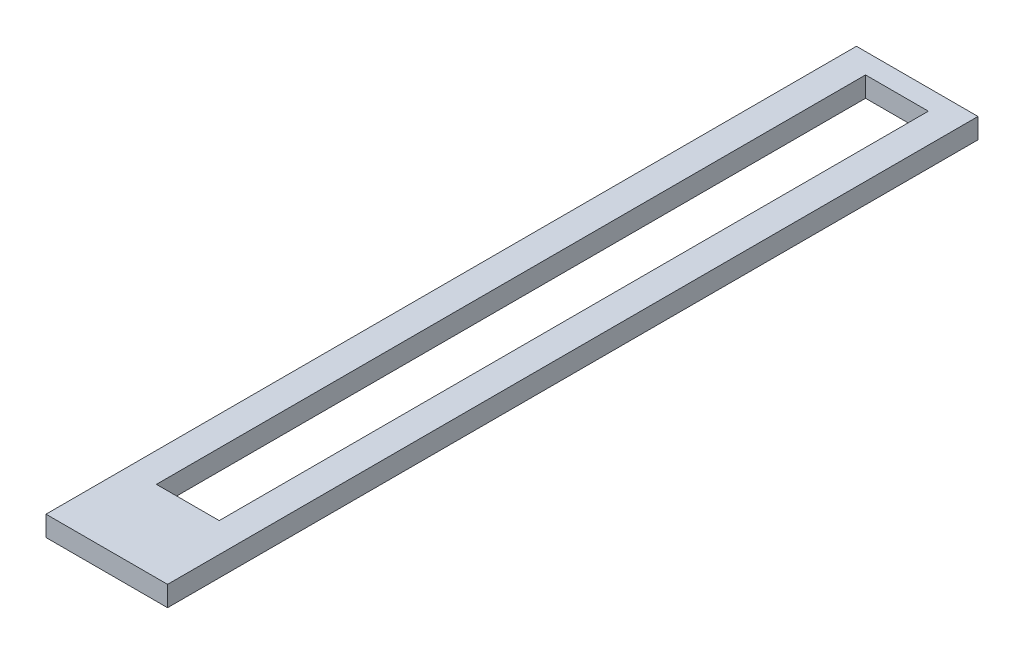
ISO-10303-21;
HEADER;
FILE_DESCRIPTION(('STEP AP214'),'2;1');
FILE_NAME('part.step','',(''),(''),'','','');
FILE_SCHEMA(('AUTOMOTIVE_DESIGN { 1 0 10303 214 1 1 1 1 }'));
ENDSEC;
DATA;
#1=APPLICATION_CONTEXT('core data for automotive mechanical design processes');
#2=APPLICATION_PROTOCOL_DEFINITION('international standard','automotive_design',2000,#1);
#3=PRODUCT_CONTEXT('',#1,'mechanical');
#4=PRODUCT('Part','Part','',(#3));
#5=PRODUCT_RELATED_PRODUCT_CATEGORY('part','',(#4));
#6=PRODUCT_DEFINITION_FORMATION('','',#4);
#7=PRODUCT_DEFINITION_CONTEXT('part definition',#1,'design');
#8=PRODUCT_DEFINITION('design','',#6,#7);
#9=PRODUCT_DEFINITION_SHAPE('','',#8);
#10=(LENGTH_UNIT() NAMED_UNIT(*) SI_UNIT(.MILLI.,.METRE.));
#11=(NAMED_UNIT(*) PLANE_ANGLE_UNIT() SI_UNIT($,.RADIAN.));
#12=(NAMED_UNIT(*) SI_UNIT($,.STERADIAN.) SOLID_ANGLE_UNIT());
#13=UNCERTAINTY_MEASURE_WITH_UNIT(LENGTH_MEASURE(1.E-05),#10,'distance_accuracy_value','');
#14=(GEOMETRIC_REPRESENTATION_CONTEXT(3) GLOBAL_UNCERTAINTY_ASSIGNED_CONTEXT((#13)) GLOBAL_UNIT_ASSIGNED_CONTEXT((#10,
#11,#12)) REPRESENTATION_CONTEXT('',''));
#15=CARTESIAN_POINT('',(0.,0.,0.));
#16=DIRECTION('',(0.,0.,1.));
#17=DIRECTION('',(1.,0.,0.));
#18=AXIS2_PLACEMENT_3D('',#15,#16,#17);
#19=CARTESIAN_POINT('',(15.,5.,100.));
#20=DIRECTION('',(-1.,0.,0.));
#21=DIRECTION('',(0.,0.,1.));
#22=AXIS2_PLACEMENT_3D('',#19,#20,#21);
#23=PLANE('',#22);
#24=DIRECTION('',(0.,0.,-1.));
#25=VECTOR('',#24,1.);
#26=CARTESIAN_POINT('',(15.,0.,100.));
#27=LINE('',#26,#25);
#28=CARTESIAN_POINT('',(15.,0.,100.));
#29=VERTEX_POINT('',#28);
#30=CARTESIAN_POINT('',(15.,0.,-99.9999999999999));
#31=VERTEX_POINT('',#30);
#32=EDGE_CURVE('E153',#29,#31,#27,.T.);
#33=ORIENTED_EDGE('',*,*,#32,.T.);
#34=DIRECTION('',(0.,-1.,0.));
#35=VECTOR('',#34,1.);
#36=CARTESIAN_POINT('',(15.,5.,-99.9999999999999));
#37=LINE('',#36,#35);
#38=CARTESIAN_POINT('',(15.,5.,-99.9999999999999));
#39=VERTEX_POINT('',#38);
#40=EDGE_CURVE('E11',#39,#31,#37,.T.);
#41=ORIENTED_EDGE('',*,*,#40,.F.);
#42=DIRECTION('',(0.,0.,-1.));
#43=VECTOR('',#42,1.);
#44=CARTESIAN_POINT('',(15.,5.,100.));
#45=LINE('',#44,#43);
#46=CARTESIAN_POINT('',(15.,5.,100.));
#47=VERTEX_POINT('',#46);
#48=EDGE_CURVE('E159',#47,#39,#45,.T.);
#49=ORIENTED_EDGE('',*,*,#48,.F.);
#50=DIRECTION('',(0.,-1.,0.));
#51=VECTOR('',#50,1.);
#52=CARTESIAN_POINT('',(15.,5.,100.));
#53=LINE('',#52,#51);
#54=EDGE_CURVE('E173',#47,#29,#53,.T.);
#55=ORIENTED_EDGE('',*,*,#54,.T.);
#56=EDGE_LOOP('',(#33,#41,#49,#55));
#57=FACE_BOUND('',#56,.T.);
#58=ADVANCED_FACE('F45',(#57),#23,.F.);
#59=CARTESIAN_POINT('',(-15.,5.,-99.9999999999999));
#60=DIRECTION('',(0.,0.,1.));
#61=DIRECTION('',(1.,0.,0.));
#62=AXIS2_PLACEMENT_3D('',#59,#60,#61);
#63=PLANE('',#62);
#64=DIRECTION('',(-1.,0.,0.));
#65=VECTOR('',#64,1.);
#66=CARTESIAN_POINT('',(-15.,0.,-99.9999999999999));
#67=LINE('',#66,#65);
#68=CARTESIAN_POINT('',(-15.,0.,-99.9999999999999));
#69=VERTEX_POINT('',#68);
#70=EDGE_CURVE('E177',#31,#69,#67,.T.);
#71=ORIENTED_EDGE('',*,*,#70,.T.);
#72=DIRECTION('',(0.,-1.,0.));
#73=VECTOR('',#72,1.);
#74=CARTESIAN_POINT('',(-15.,5.,-99.9999999999999));
#75=LINE('',#74,#73);
#76=CARTESIAN_POINT('',(-15.,5.,-99.9999999999999));
#77=VERTEX_POINT('',#76);
#78=EDGE_CURVE('E53',#77,#69,#75,.T.);
#79=ORIENTED_EDGE('',*,*,#78,.F.);
#80=DIRECTION('',(-1.,0.,0.));
#81=VECTOR('',#80,1.);
#82=CARTESIAN_POINT('',(-15.,5.,-99.9999999999999));
#83=LINE('',#82,#81);
#84=EDGE_CURVE('E163',#39,#77,#83,.T.);
#85=ORIENTED_EDGE('',*,*,#84,.F.);
#86=ORIENTED_EDGE('',*,*,#40,.T.);
#87=EDGE_LOOP('',(#71,#79,#85,#86));
#88=FACE_BOUND('',#87,.T.);
#89=ADVANCED_FACE('F211',(#88),#63,.F.);
#90=CARTESIAN_POINT('',(-15.,5.,100.));
#91=DIRECTION('',(1.,0.,0.));
#92=DIRECTION('',(0.,0.,-1.));
#93=AXIS2_PLACEMENT_3D('',#90,#91,#92);
#94=PLANE('',#93);
#95=DIRECTION('',(0.,0.,1.));
#96=VECTOR('',#95,1.);
#97=CARTESIAN_POINT('',(-15.,0.,100.));
#98=LINE('',#97,#96);
#99=CARTESIAN_POINT('',(-15.,0.,100.));
#100=VERTEX_POINT('',#99);
#101=EDGE_CURVE('E180',#69,#100,#98,.T.);
#102=ORIENTED_EDGE('',*,*,#101,.T.);
#103=DIRECTION('',(0.,-1.,0.));
#104=VECTOR('',#103,1.);
#105=CARTESIAN_POINT('',(-15.,5.,100.));
#106=LINE('',#105,#104);
#107=CARTESIAN_POINT('',(-15.,5.,100.));
#108=VERTEX_POINT('',#107);
#109=EDGE_CURVE('E188',#108,#100,#106,.T.);
#110=ORIENTED_EDGE('',*,*,#109,.F.);
#111=DIRECTION('',(0.,0.,1.));
#112=VECTOR('',#111,1.);
#113=CARTESIAN_POINT('',(-15.,5.,100.));
#114=LINE('',#113,#112);
#115=EDGE_CURVE('E167',#77,#108,#114,.T.);
#116=ORIENTED_EDGE('',*,*,#115,.F.);
#117=ORIENTED_EDGE('',*,*,#78,.T.);
#118=EDGE_LOOP('',(#102,#110,#116,#117));
#119=FACE_BOUND('',#118,.T.);
#120=ADVANCED_FACE('F197',(#119),#94,.F.);
#121=CARTESIAN_POINT('',(-15.,5.,100.));
#122=DIRECTION('',(0.,0.,-1.));
#123=DIRECTION('',(-1.,0.,0.));
#124=AXIS2_PLACEMENT_3D('',#121,#122,#123);
#125=PLANE('',#124);
#126=DIRECTION('',(1.,0.,0.));
#127=VECTOR('',#126,1.);
#128=CARTESIAN_POINT('',(-15.,0.,100.));
#129=LINE('',#128,#127);
#130=EDGE_CURVE('E164',#100,#29,#129,.T.);
#131=ORIENTED_EDGE('',*,*,#130,.T.);
#132=ORIENTED_EDGE('',*,*,#54,.F.);
#133=DIRECTION('',(1.,0.,0.));
#134=VECTOR('',#133,1.);
#135=CARTESIAN_POINT('',(-15.,5.,100.));
#136=LINE('',#135,#134);
#137=EDGE_CURVE('E170',#108,#47,#136,.T.);
#138=ORIENTED_EDGE('',*,*,#137,.F.);
#139=ORIENTED_EDGE('',*,*,#109,.T.);
#140=EDGE_LOOP('',(#131,#132,#138,#139));
#141=FACE_BOUND('',#140,.T.);
#142=ADVANCED_FACE('F204',(#141),#125,.F.);
#143=CARTESIAN_POINT('',(0.,5.,0.));
#144=DIRECTION('',(0.,-1.,0.));
#145=DIRECTION('',(0.,0.,-1.));
#146=AXIS2_PLACEMENT_3D('',#143,#144,#145);
#147=PLANE('',#146);
#148=DIRECTION('',(1.,0.,0.));
#149=VECTOR('',#148,1.);
#150=CARTESIAN_POINT('',(-7.74999999999998,5.,80.0000000000001));
#151=LINE('',#150,#149);
#152=CARTESIAN_POINT('',(-7.74999999999998,5.,80.0000000000001));
#153=VERTEX_POINT('',#152);
#154=CARTESIAN_POINT('',(7.75000000000002,5.,80.0000000000001));
#155=VERTEX_POINT('',#154);
#156=EDGE_CURVE('E144',#153,#155,#151,.T.);
#157=ORIENTED_EDGE('',*,*,#156,.F.);
#158=DIRECTION('',(0.,0.,1.));
#159=VECTOR('',#158,1.);
#160=CARTESIAN_POINT('',(-7.75,5.,-94.9999999999999));
#161=LINE('',#160,#159);
#162=CARTESIAN_POINT('',(-7.75,5.,-94.9999999999999));
#163=VERTEX_POINT('',#162);
#164=EDGE_CURVE('E60',#163,#153,#161,.T.);
#165=ORIENTED_EDGE('',*,*,#164,.F.);
#166=DIRECTION('',(-1.,0.,0.));
#167=VECTOR('',#166,1.);
#168=CARTESIAN_POINT('',(-7.75,5.,-94.9999999999999));
#169=LINE('',#168,#167);
#170=CARTESIAN_POINT('',(7.75,5.,-94.9999999999999));
#171=VERTEX_POINT('',#170);
#172=EDGE_CURVE('E131',#171,#163,#169,.T.);
#173=ORIENTED_EDGE('',*,*,#172,.F.);
#174=DIRECTION('',(0.,0.,-1.));
#175=VECTOR('',#174,1.);
#176=CARTESIAN_POINT('',(7.75,5.,-94.9999999999999));
#177=LINE('',#176,#175);
#178=EDGE_CURVE('E135',#155,#171,#177,.T.);
#179=ORIENTED_EDGE('',*,*,#178,.F.);
#180=EDGE_LOOP('',(#157,#165,#173,#179));
#181=FACE_BOUND('',#180,.T.);
#182=ORIENTED_EDGE('',*,*,#48,.T.);
#183=ORIENTED_EDGE('',*,*,#84,.T.);
#184=ORIENTED_EDGE('',*,*,#115,.T.);
#185=ORIENTED_EDGE('',*,*,#137,.T.);
#186=EDGE_LOOP('',(#182,#183,#184,#185));
#187=FACE_BOUND('',#186,.T.);
#188=ADVANCED_FACE('F210',(#181,#187),#147,.F.);
#189=CARTESIAN_POINT('',(0.,0.,0.));
#190=DIRECTION('',(0.,-1.,0.));
#191=DIRECTION('',(0.,0.,-1.));
#192=AXIS2_PLACEMENT_3D('',#189,#190,#191);
#193=PLANE('',#192);
#194=DIRECTION('',(0.,0.,1.));
#195=VECTOR('',#194,1.);
#196=CARTESIAN_POINT('',(-7.75,0.,-94.9999999999999));
#197=LINE('',#196,#195);
#198=CARTESIAN_POINT('',(-7.75,0.,-94.9999999999999));
#199=VERTEX_POINT('',#198);
#200=CARTESIAN_POINT('',(-7.74999999999998,0.,80.0000000000001));
#201=VERTEX_POINT('',#200);
#202=EDGE_CURVE('E112',#199,#201,#197,.T.);
#203=ORIENTED_EDGE('',*,*,#202,.T.);
#204=DIRECTION('',(1.,0.,0.));
#205=VECTOR('',#204,1.);
#206=CARTESIAN_POINT('',(-7.74999999999998,0.,80.0000000000001));
#207=LINE('',#206,#205);
#208=CARTESIAN_POINT('',(7.75000000000002,0.,80.0000000000001));
#209=VERTEX_POINT('',#208);
#210=EDGE_CURVE('E122',#201,#209,#207,.T.);
#211=ORIENTED_EDGE('',*,*,#210,.T.);
#212=DIRECTION('',(0.,0.,-1.));
#213=VECTOR('',#212,1.);
#214=CARTESIAN_POINT('',(7.75,0.,-94.9999999999999));
#215=LINE('',#214,#213);
#216=CARTESIAN_POINT('',(7.75,0.,-94.9999999999999));
#217=VERTEX_POINT('',#216);
#218=EDGE_CURVE('E68',#209,#217,#215,.T.);
#219=ORIENTED_EDGE('',*,*,#218,.T.);
#220=DIRECTION('',(-1.,0.,0.));
#221=VECTOR('',#220,1.);
#222=CARTESIAN_POINT('',(-7.75,0.,-94.9999999999999));
#223=LINE('',#222,#221);
#224=EDGE_CURVE('E119',#217,#199,#223,.T.);
#225=ORIENTED_EDGE('',*,*,#224,.T.);
#226=EDGE_LOOP('',(#203,#211,#219,#225));
#227=FACE_BOUND('',#226,.T.);
#228=ORIENTED_EDGE('',*,*,#32,.F.);
#229=ORIENTED_EDGE('',*,*,#130,.F.);
#230=ORIENTED_EDGE('',*,*,#101,.F.);
#231=ORIENTED_EDGE('',*,*,#70,.F.);
#232=EDGE_LOOP('',(#228,#229,#230,#231));
#233=FACE_BOUND('',#232,.T.);
#234=ADVANCED_FACE('F127',(#227,#233),#193,.T.);
#235=CARTESIAN_POINT('',(-7.75,0.,-94.9999999999999));
#236=DIRECTION('',(-1.,0.,0.));
#237=DIRECTION('',(0.,0.,1.));
#238=AXIS2_PLACEMENT_3D('',#235,#236,#237);
#239=PLANE('',#238);
#240=ORIENTED_EDGE('',*,*,#164,.T.);
#241=DIRECTION('',(0.,1.,0.));
#242=VECTOR('',#241,1.);
#243=CARTESIAN_POINT('',(-7.74999999999998,0.,80.0000000000001));
#244=LINE('',#243,#242);
#245=EDGE_CURVE('E108',#201,#153,#244,.T.);
#246=ORIENTED_EDGE('',*,*,#245,.F.);
#247=ORIENTED_EDGE('',*,*,#202,.F.);
#248=DIRECTION('',(0.,1.,0.));
#249=VECTOR('',#248,1.);
#250=CARTESIAN_POINT('',(-7.75,0.,-94.9999999999999));
#251=LINE('',#250,#249);
#252=EDGE_CURVE('E150',#199,#163,#251,.T.);
#253=ORIENTED_EDGE('',*,*,#252,.T.);
#254=EDGE_LOOP('',(#240,#246,#247,#253));
#255=FACE_BOUND('',#254,.T.);
#256=ADVANCED_FACE('F110',(#255),#239,.F.);
#257=CARTESIAN_POINT('',(-7.75,0.,-94.9999999999999));
#258=DIRECTION('',(0.,0.,-1.));
#259=DIRECTION('',(-1.,0.,0.));
#260=AXIS2_PLACEMENT_3D('',#257,#258,#259);
#261=PLANE('',#260);
#262=ORIENTED_EDGE('',*,*,#172,.T.);
#263=ORIENTED_EDGE('',*,*,#252,.F.);
#264=ORIENTED_EDGE('',*,*,#224,.F.);
#265=DIRECTION('',(0.,1.,0.));
#266=VECTOR('',#265,1.);
#267=CARTESIAN_POINT('',(7.75,0.,-94.9999999999999));
#268=LINE('',#267,#266);
#269=EDGE_CURVE('E154',#217,#171,#268,.T.);
#270=ORIENTED_EDGE('',*,*,#269,.T.);
#271=EDGE_LOOP('',(#262,#263,#264,#270));
#272=FACE_BOUND('',#271,.T.);
#273=ADVANCED_FACE('F228',(#272),#261,.F.);
#274=CARTESIAN_POINT('',(7.75,0.,-94.9999999999999));
#275=DIRECTION('',(1.,0.,0.));
#276=DIRECTION('',(0.,0.,-1.));
#277=AXIS2_PLACEMENT_3D('',#274,#275,#276);
#278=PLANE('',#277);
#279=ORIENTED_EDGE('',*,*,#178,.T.);
#280=ORIENTED_EDGE('',*,*,#269,.F.);
#281=ORIENTED_EDGE('',*,*,#218,.F.);
#282=DIRECTION('',(0.,1.,0.));
#283=VECTOR('',#282,1.);
#284=CARTESIAN_POINT('',(7.75000000000002,0.,80.0000000000001));
#285=LINE('',#284,#283);
#286=EDGE_CURVE('E118',#209,#155,#285,.T.);
#287=ORIENTED_EDGE('',*,*,#286,.T.);
#288=EDGE_LOOP('',(#279,#280,#281,#287));
#289=FACE_BOUND('',#288,.T.);
#290=ADVANCED_FACE('F231',(#289),#278,.F.);
#291=CARTESIAN_POINT('',(-7.74999999999998,0.,80.0000000000001));
#292=DIRECTION('',(0.,0.,1.));
#293=DIRECTION('',(1.,0.,0.));
#294=AXIS2_PLACEMENT_3D('',#291,#292,#293);
#295=PLANE('',#294);
#296=ORIENTED_EDGE('',*,*,#156,.T.);
#297=ORIENTED_EDGE('',*,*,#286,.F.);
#298=ORIENTED_EDGE('',*,*,#210,.F.);
#299=ORIENTED_EDGE('',*,*,#245,.T.);
#300=EDGE_LOOP('',(#296,#297,#298,#299));
#301=FACE_BOUND('',#300,.T.);
#302=ADVANCED_FACE('F123',(#301),#295,.F.);
#303=CLOSED_SHELL('',(#58,#89,#120,#142,#188,#234,#256,#273,#290,#302));
#304=MANIFOLD_SOLID_BREP('B2',#303);
#305=ADVANCED_BREP_SHAPE_REPRESENTATION('',(#18,#304),#14);
#306=SHAPE_DEFINITION_REPRESENTATION(#9,#305);
ENDSEC;
END-ISO-10303-21;
